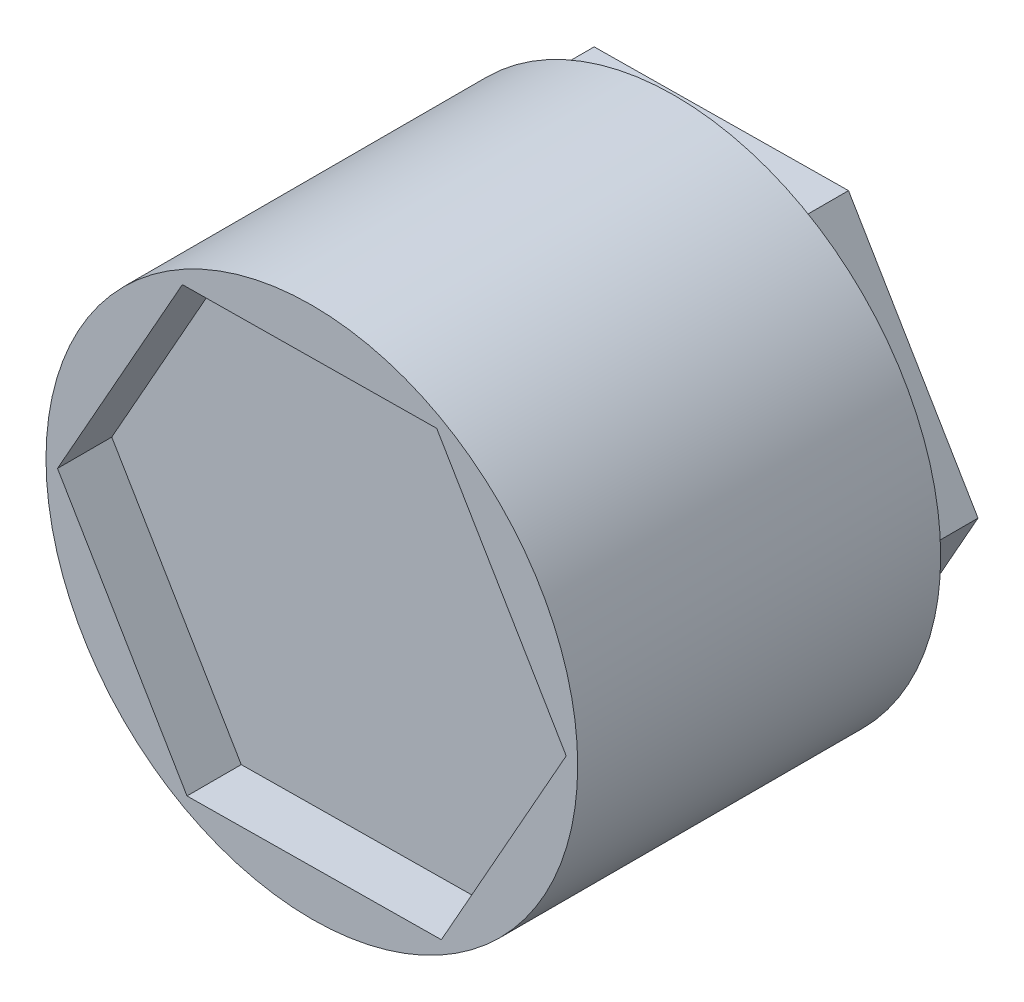
ISO-10303-21;
HEADER;
FILE_DESCRIPTION(('STEP AP214'),'2;1');
FILE_NAME('part.step','',(''),(''),'','','');
FILE_SCHEMA(('AUTOMOTIVE_DESIGN { 1 0 10303 214 1 1 1 1 }'));
ENDSEC;
DATA;
#1=APPLICATION_CONTEXT('core data for automotive mechanical design processes');
#2=APPLICATION_PROTOCOL_DEFINITION('international standard','automotive_design',2000,#1);
#3=PRODUCT_CONTEXT('',#1,'mechanical');
#4=PRODUCT('Part','Part','',(#3));
#5=PRODUCT_RELATED_PRODUCT_CATEGORY('part','',(#4));
#6=PRODUCT_DEFINITION_FORMATION('','',#4);
#7=PRODUCT_DEFINITION_CONTEXT('part definition',#1,'design');
#8=PRODUCT_DEFINITION('design','',#6,#7);
#9=PRODUCT_DEFINITION_SHAPE('','',#8);
#10=(LENGTH_UNIT() NAMED_UNIT(*) SI_UNIT(.MILLI.,.METRE.));
#11=(NAMED_UNIT(*) PLANE_ANGLE_UNIT() SI_UNIT($,.RADIAN.));
#12=(NAMED_UNIT(*) SI_UNIT($,.STERADIAN.) SOLID_ANGLE_UNIT());
#13=UNCERTAINTY_MEASURE_WITH_UNIT(LENGTH_MEASURE(1.E-05),#10,'distance_accuracy_value','');
#14=(GEOMETRIC_REPRESENTATION_CONTEXT(3) GLOBAL_UNCERTAINTY_ASSIGNED_CONTEXT((#13)) GLOBAL_UNIT_ASSIGNED_CONTEXT((#10,
#11,#12)) REPRESENTATION_CONTEXT('',''));
#15=CARTESIAN_POINT('',(0.,0.,0.));
#16=DIRECTION('',(0.,0.,1.));
#17=DIRECTION('',(1.,0.,0.));
#18=AXIS2_PLACEMENT_3D('',#15,#16,#17);
#19=CARTESIAN_POINT('',(11.5060062346083,20.4221730935395,4.5));
#20=DIRECTION('',(0.0105199839304371,-0.999944663437984,0.));
#21=DIRECTION('',(0.999944663437984,0.0105199839304371,0.));
#22=AXIS2_PLACEMENT_3D('',#19,#20,#21);
#23=PLANE('',#22);
#24=DIRECTION('',(-0.999944663437984,-0.0105199839304371,0.));
#25=VECTOR('',#24,1.);
#26=CARTESIAN_POINT('',(11.5060062346083,20.4221730935395,0.));
#27=LINE('',#26,#25);
#28=CARTESIAN_POINT('',(11.5060062346083,20.4221730935395,0.));
#29=VERTEX_POINT('',#28);
#30=CARTESIAN_POINT('',(-11.9331175821841,20.1755802420427,0.));
#31=VERTEX_POINT('',#30);
#32=EDGE_CURVE('E139',#29,#31,#27,.T.);
#33=ORIENTED_EDGE('',*,*,#32,.T.);
#34=DIRECTION('',(0.,0.,-1.));
#35=VECTOR('',#34,1.);
#36=CARTESIAN_POINT('',(-11.9331175821841,20.1755802420427,4.5));
#37=LINE('',#36,#35);
#38=CARTESIAN_POINT('',(-11.9331175821841,20.1755802420427,4.5));
#39=VERTEX_POINT('',#38);
#40=EDGE_CURVE('E11',#39,#31,#37,.T.);
#41=ORIENTED_EDGE('',*,*,#40,.F.);
#42=DIRECTION('',(-0.999944663437984,-0.0105199839304371,0.));
#43=VECTOR('',#42,1.);
#44=CARTESIAN_POINT('',(11.5060062346083,20.4221730935395,4.5));
#45=LINE('',#44,#43);
#46=CARTESIAN_POINT('',(11.5060062346083,20.4221730935395,4.5));
#47=VERTEX_POINT('',#46);
#48=EDGE_CURVE('E128',#47,#39,#45,.T.);
#49=ORIENTED_EDGE('',*,*,#48,.F.);
#50=DIRECTION('',(0.,0.,-1.));
#51=VECTOR('',#50,1.);
#52=CARTESIAN_POINT('',(11.5060062346083,20.4221730935395,4.5));
#53=LINE('',#52,#51);
#54=EDGE_CURVE('E140',#47,#29,#53,.T.);
#55=ORIENTED_EDGE('',*,*,#54,.T.);
#56=EDGE_LOOP('',(#33,#41,#49,#55));
#57=FACE_BOUND('',#56,.T.);
#58=ADVANCED_FACE('F39',(#57),#23,.F.);
#59=CARTESIAN_POINT('',(-11.9331175821841,20.1755802420427,4.5));
#60=DIRECTION('',(0.871237472881193,-0.490861758387829,0.));
#61=DIRECTION('',(0.490861758387829,0.871237472881194,0.));
#62=AXIS2_PLACEMENT_3D('',#59,#60,#61);
#63=PLANE('',#62);
#64=DIRECTION('',(-0.490861758387829,-0.871237472881193,0.));
#65=VECTOR('',#64,1.);
#66=CARTESIAN_POINT('',(-11.9331175821841,20.1755802420427,0.));
#67=LINE('',#66,#65);
#68=CARTESIAN_POINT('',(-23.4391238167924,-0.246592851496795,0.));
#69=VERTEX_POINT('',#68);
#70=EDGE_CURVE('E143',#31,#69,#67,.T.);
#71=ORIENTED_EDGE('',*,*,#70,.T.);
#72=DIRECTION('',(0.,0.,-1.));
#73=VECTOR('',#72,1.);
#74=CARTESIAN_POINT('',(-23.4391238167924,-0.246592851496795,4.5));
#75=LINE('',#74,#73);
#76=CARTESIAN_POINT('',(-23.4391238167924,-0.246592851496795,4.5));
#77=VERTEX_POINT('',#76);
#78=EDGE_CURVE('E46',#77,#69,#75,.T.);
#79=ORIENTED_EDGE('',*,*,#78,.F.);
#80=DIRECTION('',(-0.490861758387829,-0.871237472881193,0.));
#81=VECTOR('',#80,1.);
#82=CARTESIAN_POINT('',(-11.9331175821841,20.1755802420427,4.5));
#83=LINE('',#82,#81);
#84=EDGE_CURVE('E100',#39,#77,#83,.T.);
#85=ORIENTED_EDGE('',*,*,#84,.F.);
#86=ORIENTED_EDGE('',*,*,#40,.T.);
#87=EDGE_LOOP('',(#71,#79,#85,#86));
#88=FACE_BOUND('',#87,.T.);
#89=ADVANCED_FACE('F280',(#88),#63,.F.);
#90=CARTESIAN_POINT('',(-23.4391238167924,-0.246592851496795,4.5));
#91=DIRECTION('',(0.860717488950756,0.509082905050155,0.));
#92=DIRECTION('',(-0.509082905050155,0.860717488950756,0.));
#93=AXIS2_PLACEMENT_3D('',#90,#91,#92);
#94=PLANE('',#93);
#95=DIRECTION('',(0.509082905050155,-0.860717488950756,0.));
#96=VECTOR('',#95,1.);
#97=CARTESIAN_POINT('',(-23.4391238167924,-0.246592851496795,0.));
#98=LINE('',#97,#96);
#99=CARTESIAN_POINT('',(-11.5060062346083,-20.4221730935395,0.));
#100=VERTEX_POINT('',#99);
#101=EDGE_CURVE('E114',#69,#100,#98,.T.);
#102=ORIENTED_EDGE('',*,*,#101,.T.);
#103=DIRECTION('',(0.,0.,-1.));
#104=VECTOR('',#103,1.);
#105=CARTESIAN_POINT('',(-11.5060062346083,-20.4221730935395,4.5));
#106=LINE('',#105,#104);
#107=CARTESIAN_POINT('',(-11.5060062346083,-20.4221730935395,4.5));
#108=VERTEX_POINT('',#107);
#109=EDGE_CURVE('E106',#108,#100,#106,.T.);
#110=ORIENTED_EDGE('',*,*,#109,.F.);
#111=DIRECTION('',(0.509082905050155,-0.860717488950756,0.));
#112=VECTOR('',#111,1.);
#113=CARTESIAN_POINT('',(-23.4391238167924,-0.246592851496795,4.5));
#114=LINE('',#113,#112);
#115=EDGE_CURVE('E112',#77,#108,#114,.T.);
#116=ORIENTED_EDGE('',*,*,#115,.F.);
#117=ORIENTED_EDGE('',*,*,#78,.T.);
#118=EDGE_LOOP('',(#102,#110,#116,#117));
#119=FACE_BOUND('',#118,.T.);
#120=ADVANCED_FACE('F107',(#119),#94,.F.);
#121=CARTESIAN_POINT('',(-11.5060062346083,-20.4221730935395,4.5));
#122=DIRECTION('',(-0.0105199839304372,0.999944663437984,0.));
#123=DIRECTION('',(-0.999944663437984,-0.0105199839304372,0.));
#124=AXIS2_PLACEMENT_3D('',#121,#122,#123);
#125=PLANE('',#124);
#126=DIRECTION('',(0.999944663437984,0.0105199839304372,0.));
#127=VECTOR('',#126,1.);
#128=CARTESIAN_POINT('',(-11.5060062346083,-20.4221730935395,0.));
#129=LINE('',#128,#127);
#130=CARTESIAN_POINT('',(11.9331175821841,-20.1755802420427,0.));
#131=VERTEX_POINT('',#130);
#132=EDGE_CURVE('E144',#100,#131,#129,.T.);
#133=ORIENTED_EDGE('',*,*,#132,.T.);
#134=DIRECTION('',(0.,0.,-1.));
#135=VECTOR('',#134,1.);
#136=CARTESIAN_POINT('',(11.9331175821841,-20.1755802420427,4.5));
#137=LINE('',#136,#135);
#138=CARTESIAN_POINT('',(11.9331175821841,-20.1755802420427,4.5));
#139=VERTEX_POINT('',#138);
#140=EDGE_CURVE('E117',#139,#131,#137,.T.);
#141=ORIENTED_EDGE('',*,*,#140,.F.);
#142=DIRECTION('',(0.999944663437984,0.0105199839304372,0.));
#143=VECTOR('',#142,1.);
#144=CARTESIAN_POINT('',(-11.5060062346083,-20.4221730935395,4.5));
#145=LINE('',#144,#143);
#146=EDGE_CURVE('E116',#108,#139,#145,.T.);
#147=ORIENTED_EDGE('',*,*,#146,.F.);
#148=ORIENTED_EDGE('',*,*,#109,.T.);
#149=EDGE_LOOP('',(#133,#141,#147,#148));
#150=FACE_BOUND('',#149,.T.);
#151=ADVANCED_FACE('F118',(#150),#125,.F.);
#152=CARTESIAN_POINT('',(11.9331175821841,-20.1755802420427,4.5));
#153=DIRECTION('',(-0.871237472881193,0.490861758387829,0.));
#154=DIRECTION('',(-0.490861758387829,-0.871237472881194,0.));
#155=AXIS2_PLACEMENT_3D('',#152,#153,#154);
#156=PLANE('',#155);
#157=DIRECTION('',(0.490861758387829,0.871237472881193,0.));
#158=VECTOR('',#157,1.);
#159=CARTESIAN_POINT('',(11.9331175821841,-20.1755802420427,0.));
#160=LINE('',#159,#158);
#161=CARTESIAN_POINT('',(23.4391238167924,0.246592851496804,0.));
#162=VERTEX_POINT('',#161);
#163=EDGE_CURVE('E150',#131,#162,#160,.T.);
#164=ORIENTED_EDGE('',*,*,#163,.T.);
#165=DIRECTION('',(0.,0.,-1.));
#166=VECTOR('',#165,1.);
#167=CARTESIAN_POINT('',(23.4391238167924,0.246592851496804,4.5));
#168=LINE('',#167,#166);
#169=CARTESIAN_POINT('',(23.4391238167924,0.246592851496804,4.5));
#170=VERTEX_POINT('',#169);
#171=EDGE_CURVE('E65',#170,#162,#168,.T.);
#172=ORIENTED_EDGE('',*,*,#171,.F.);
#173=DIRECTION('',(0.490861758387829,0.871237472881193,0.));
#174=VECTOR('',#173,1.);
#175=CARTESIAN_POINT('',(11.9331175821841,-20.1755802420427,4.5));
#176=LINE('',#175,#174);
#177=EDGE_CURVE('E121',#139,#170,#176,.T.);
#178=ORIENTED_EDGE('',*,*,#177,.F.);
#179=ORIENTED_EDGE('',*,*,#140,.T.);
#180=EDGE_LOOP('',(#164,#172,#178,#179));
#181=FACE_BOUND('',#180,.T.);
#182=ADVANCED_FACE('F156',(#181),#156,.F.);
#183=CARTESIAN_POINT('',(23.4391238167924,0.246592851496804,4.5));
#184=DIRECTION('',(-0.860717488950756,-0.509082905050155,0.));
#185=DIRECTION('',(0.509082905050155,-0.860717488950756,0.));
#186=AXIS2_PLACEMENT_3D('',#183,#184,#185);
#187=PLANE('',#186);
#188=DIRECTION('',(-0.509082905050155,0.860717488950756,0.));
#189=VECTOR('',#188,1.);
#190=CARTESIAN_POINT('',(23.4391238167924,0.246592851496804,0.));
#191=LINE('',#190,#189);
#192=EDGE_CURVE('E90',#162,#29,#191,.T.);
#193=ORIENTED_EDGE('',*,*,#192,.T.);
#194=ORIENTED_EDGE('',*,*,#54,.F.);
#195=DIRECTION('',(-0.509082905050155,0.860717488950756,0.));
#196=VECTOR('',#195,1.);
#197=CARTESIAN_POINT('',(23.4391238167924,0.246592851496804,4.5));
#198=LINE('',#197,#196);
#199=EDGE_CURVE('E133',#170,#47,#198,.T.);
#200=ORIENTED_EDGE('',*,*,#199,.F.);
#201=ORIENTED_EDGE('',*,*,#171,.T.);
#202=EDGE_LOOP('',(#193,#194,#200,#201));
#203=FACE_BOUND('',#202,.T.);
#204=ADVANCED_FACE('F157',(#203),#187,.F.);
#205=CARTESIAN_POINT('',(0.,0.,0.));
#206=DIRECTION('',(0.,0.,1.));
#207=DIRECTION('',(1.,0.,0.));
#208=AXIS2_PLACEMENT_3D('',#205,#206,#207);
#209=PLANE('',#208);
#210=ORIENTED_EDGE('',*,*,#32,.F.);
#211=ORIENTED_EDGE('',*,*,#192,.F.);
#212=ORIENTED_EDGE('',*,*,#163,.F.);
#213=ORIENTED_EDGE('',*,*,#132,.F.);
#214=ORIENTED_EDGE('',*,*,#101,.F.);
#215=ORIENTED_EDGE('',*,*,#70,.F.);
#216=EDGE_LOOP('',(#210,#211,#212,#213,#214,#215));
#217=FACE_BOUND('',#216,.T.);
#218=ADVANCED_FACE('F152',(#217),#209,.F.);
#219=CARTESIAN_POINT('',(0.,0.,4.5));
#220=DIRECTION('',(0.,0.,1.));
#221=DIRECTION('',(1.,0.,0.));
#222=AXIS2_PLACEMENT_3D('',#219,#220,#221);
#223=PLANE('',#222);
#224=CARTESIAN_POINT('',(0.,0.,4.5));
#225=DIRECTION('',(0.,0.,1.));
#226=DIRECTION('',(1.,0.,0.));
#227=AXIS2_PLACEMENT_3D('',#224,#225,#226);
#228=CIRCLE('',#227,24.5);
#229=CARTESIAN_POINT('',(24.5,0.,4.5));
#230=VERTEX_POINT('',#229);
#231=EDGE_CURVE('E165',#230,#230,#228,.T.);
#232=ORIENTED_EDGE('',*,*,#231,.F.);
#233=EDGE_LOOP('',(#232));
#234=FACE_BOUND('',#233,.T.);
#235=ORIENTED_EDGE('',*,*,#199,.T.);
#236=ORIENTED_EDGE('',*,*,#48,.T.);
#237=ORIENTED_EDGE('',*,*,#84,.T.);
#238=ORIENTED_EDGE('',*,*,#115,.T.);
#239=ORIENTED_EDGE('',*,*,#146,.T.);
#240=ORIENTED_EDGE('',*,*,#177,.T.);
#241=EDGE_LOOP('',(#235,#236,#237,#238,#239,#240));
#242=FACE_BOUND('',#241,.T.);
#243=ADVANCED_FACE('F130',(#234,#242),#223,.F.);
#244=CARTESIAN_POINT('',(0.,0.,37.95));
#245=DIRECTION('',(0.,0.,-1.));
#246=DIRECTION('',(-1.,0.,0.));
#247=AXIS2_PLACEMENT_3D('',#244,#245,#246);
#248=CYLINDRICAL_SURFACE('',#247,24.5);
#249=CARTESIAN_POINT('',(0.,0.,37.95));
#250=DIRECTION('',(0.,0.,1.));
#251=DIRECTION('',(1.,0.,0.));
#252=AXIS2_PLACEMENT_3D('',#249,#250,#251);
#253=CIRCLE('',#252,24.5);
#254=CARTESIAN_POINT('',(24.5,0.,37.95));
#255=VERTEX_POINT('',#254);
#256=EDGE_CURVE('E142',#255,#255,#253,.T.);
#257=ORIENTED_EDGE('',*,*,#256,.F.);
#258=EDGE_LOOP('',(#257));
#259=FACE_BOUND('',#258,.T.);
#260=ORIENTED_EDGE('',*,*,#231,.T.);
#261=EDGE_LOOP('',(#260));
#262=FACE_BOUND('',#261,.T.);
#263=ADVANCED_FACE('F294',(#259,#262),#248,.T.);
#264=CARTESIAN_POINT('',(0.,0.,37.95));
#265=DIRECTION('',(0.,0.,1.));
#266=DIRECTION('',(1.,0.,0.));
#267=AXIS2_PLACEMENT_3D('',#264,#265,#266);
#268=PLANE('',#267);
#269=DIRECTION('',(-0.509082905050164,0.860717488950751,0.));
#270=VECTOR('',#269,1.);
#271=CARTESIAN_POINT('',(23.4391238167924,0.246592851497044,37.95));
#272=LINE('',#271,#270);
#273=CARTESIAN_POINT('',(23.4391238167924,0.246592851497044,37.95));
#274=VERTEX_POINT('',#273);
#275=CARTESIAN_POINT('',(11.5060062346081,20.4221730935396,37.95));
#276=VERTEX_POINT('',#275);
#277=EDGE_CURVE('E52',#274,#276,#272,.T.);
#278=ORIENTED_EDGE('',*,*,#277,.F.);
#279=DIRECTION('',(0.490861758387821,0.871237472881198,0.));
#280=VECTOR('',#279,1.);
#281=CARTESIAN_POINT('',(11.9331175821843,-20.1755802420426,37.95));
#282=LINE('',#281,#280);
#283=CARTESIAN_POINT('',(11.9331175821843,-20.1755802420426,37.95));
#284=VERTEX_POINT('',#283);
#285=EDGE_CURVE('E184',#284,#274,#282,.T.);
#286=ORIENTED_EDGE('',*,*,#285,.F.);
#287=DIRECTION('',(0.999944663437984,0.0105199839304472,0.));
#288=VECTOR('',#287,1.);
#289=CARTESIAN_POINT('',(-11.5060062346081,-20.4221730935396,37.95));
#290=LINE('',#289,#288);
#291=CARTESIAN_POINT('',(-11.5060062346081,-20.4221730935396,37.95));
#292=VERTEX_POINT('',#291);
#293=EDGE_CURVE('E189',#292,#284,#290,.T.);
#294=ORIENTED_EDGE('',*,*,#293,.F.);
#295=DIRECTION('',(0.509082905050164,-0.860717488950751,0.));
#296=VECTOR('',#295,1.);
#297=CARTESIAN_POINT('',(-23.4391238167924,-0.246592851497044,37.95));
#298=LINE('',#297,#296);
#299=CARTESIAN_POINT('',(-23.4391238167924,-0.246592851497044,37.95));
#300=VERTEX_POINT('',#299);
#301=EDGE_CURVE('E192',#300,#292,#298,.T.);
#302=ORIENTED_EDGE('',*,*,#301,.F.);
#303=DIRECTION('',(-0.49086175838782,-0.871237472881198,0.));
#304=VECTOR('',#303,1.);
#305=CARTESIAN_POINT('',(-11.9331175821843,20.1755802420425,37.95));
#306=LINE('',#305,#304);
#307=CARTESIAN_POINT('',(-11.9331175821843,20.1755802420425,37.95));
#308=VERTEX_POINT('',#307);
#309=EDGE_CURVE('E191',#308,#300,#306,.T.);
#310=ORIENTED_EDGE('',*,*,#309,.F.);
#311=DIRECTION('',(-0.999944663437984,-0.0105199839304473,0.));
#312=VECTOR('',#311,1.);
#313=CARTESIAN_POINT('',(11.5060062346081,20.4221730935396,37.95));
#314=LINE('',#313,#312);
#315=EDGE_CURVE('E197',#276,#308,#314,.T.);
#316=ORIENTED_EDGE('',*,*,#315,.F.);
#317=EDGE_LOOP('',(#278,#286,#294,#302,#310,#316));
#318=FACE_BOUND('',#317,.T.);
#319=ORIENTED_EDGE('',*,*,#256,.T.);
#320=EDGE_LOOP('',(#319));
#321=FACE_BOUND('',#320,.T.);
#322=ADVANCED_FACE('F253',(#318,#321),#268,.T.);
#323=CARTESIAN_POINT('',(23.4391238167924,0.246592851497044,32.95));
#324=DIRECTION('',(0.860717488950751,0.509082905050164,0.));
#325=DIRECTION('',(-0.509082905050164,0.860717488950751,0.));
#326=AXIS2_PLACEMENT_3D('',#323,#324,#325);
#327=PLANE('',#326);
#328=ORIENTED_EDGE('',*,*,#277,.T.);
#329=DIRECTION('',(0.,0.,1.));
#330=VECTOR('',#329,1.);
#331=CARTESIAN_POINT('',(11.5060062346081,20.4221730935396,32.95));
#332=LINE('',#331,#330);
#333=CARTESIAN_POINT('',(11.5060062346081,20.4221730935396,32.95));
#334=VERTEX_POINT('',#333);
#335=EDGE_CURVE('E169',#334,#276,#332,.T.);
#336=ORIENTED_EDGE('',*,*,#335,.F.);
#337=DIRECTION('',(-0.509082905050164,0.860717488950751,0.));
#338=VECTOR('',#337,1.);
#339=CARTESIAN_POINT('',(23.4391238167924,0.246592851497044,32.95));
#340=LINE('',#339,#338);
#341=CARTESIAN_POINT('',(23.4391238167924,0.246592851497044,32.95));
#342=VERTEX_POINT('',#341);
#343=EDGE_CURVE('E190',#342,#334,#340,.T.);
#344=ORIENTED_EDGE('',*,*,#343,.F.);
#345=DIRECTION('',(0.,0.,1.));
#346=VECTOR('',#345,1.);
#347=CARTESIAN_POINT('',(23.4391238167924,0.246592851497044,32.95));
#348=LINE('',#347,#346);
#349=EDGE_CURVE('E164',#342,#274,#348,.T.);
#350=ORIENTED_EDGE('',*,*,#349,.T.);
#351=EDGE_LOOP('',(#328,#336,#344,#350));
#352=FACE_BOUND('',#351,.T.);
#353=ADVANCED_FACE('F223',(#352),#327,.F.);
#354=CARTESIAN_POINT('',(11.9331175821843,-20.1755802420426,32.95));
#355=DIRECTION('',(0.871237472881198,-0.490861758387821,0.));
#356=DIRECTION('',(0.490861758387821,0.871237472881198,0.));
#357=AXIS2_PLACEMENT_3D('',#354,#355,#356);
#358=PLANE('',#357);
#359=ORIENTED_EDGE('',*,*,#285,.T.);
#360=ORIENTED_EDGE('',*,*,#349,.F.);
#361=DIRECTION('',(0.490861758387821,0.871237472881198,0.));
#362=VECTOR('',#361,1.);
#363=CARTESIAN_POINT('',(11.9331175821843,-20.1755802420426,32.95));
#364=LINE('',#363,#362);
#365=CARTESIAN_POINT('',(11.9331175821843,-20.1755802420426,32.95));
#366=VERTEX_POINT('',#365);
#367=EDGE_CURVE('E172',#366,#342,#364,.T.);
#368=ORIENTED_EDGE('',*,*,#367,.F.);
#369=DIRECTION('',(0.,0.,1.));
#370=VECTOR('',#369,1.);
#371=CARTESIAN_POINT('',(11.9331175821843,-20.1755802420426,32.95));
#372=LINE('',#371,#370);
#373=EDGE_CURVE('E178',#366,#284,#372,.T.);
#374=ORIENTED_EDGE('',*,*,#373,.T.);
#375=EDGE_LOOP('',(#359,#360,#368,#374));
#376=FACE_BOUND('',#375,.T.);
#377=ADVANCED_FACE('F245',(#376),#358,.F.);
#378=CARTESIAN_POINT('',(-11.5060062346081,-20.4221730935396,32.95));
#379=DIRECTION('',(0.0105199839304472,-0.999944663437984,0.));
#380=DIRECTION('',(0.999944663437984,0.0105199839304472,0.));
#381=AXIS2_PLACEMENT_3D('',#378,#379,#380);
#382=PLANE('',#381);
#383=ORIENTED_EDGE('',*,*,#293,.T.);
#384=ORIENTED_EDGE('',*,*,#373,.F.);
#385=DIRECTION('',(0.999944663437984,0.0105199839304472,0.));
#386=VECTOR('',#385,1.);
#387=CARTESIAN_POINT('',(-11.5060062346081,-20.4221730935396,32.95));
#388=LINE('',#387,#386);
#389=CARTESIAN_POINT('',(-11.5060062346081,-20.4221730935396,32.95));
#390=VERTEX_POINT('',#389);
#391=EDGE_CURVE('E201',#390,#366,#388,.T.);
#392=ORIENTED_EDGE('',*,*,#391,.F.);
#393=DIRECTION('',(0.,0.,1.));
#394=VECTOR('',#393,1.);
#395=CARTESIAN_POINT('',(-11.5060062346081,-20.4221730935396,32.95));
#396=LINE('',#395,#394);
#397=EDGE_CURVE('E180',#390,#292,#396,.T.);
#398=ORIENTED_EDGE('',*,*,#397,.T.);
#399=EDGE_LOOP('',(#383,#384,#392,#398));
#400=FACE_BOUND('',#399,.T.);
#401=ADVANCED_FACE('F250',(#400),#382,.F.);
#402=CARTESIAN_POINT('',(-23.4391238167924,-0.246592851497044,32.95));
#403=DIRECTION('',(-0.860717488950751,-0.509082905050164,0.));
#404=DIRECTION('',(0.509082905050164,-0.860717488950751,0.));
#405=AXIS2_PLACEMENT_3D('',#402,#403,#404);
#406=PLANE('',#405);
#407=ORIENTED_EDGE('',*,*,#301,.T.);
#408=ORIENTED_EDGE('',*,*,#397,.F.);
#409=DIRECTION('',(0.509082905050164,-0.860717488950751,0.));
#410=VECTOR('',#409,1.);
#411=CARTESIAN_POINT('',(-23.4391238167924,-0.246592851497044,32.95));
#412=LINE('',#411,#410);
#413=CARTESIAN_POINT('',(-23.4391238167924,-0.246592851497044,32.95));
#414=VERTEX_POINT('',#413);
#415=EDGE_CURVE('E206',#414,#390,#412,.T.);
#416=ORIENTED_EDGE('',*,*,#415,.F.);
#417=DIRECTION('',(0.,0.,1.));
#418=VECTOR('',#417,1.);
#419=CARTESIAN_POINT('',(-23.4391238167924,-0.246592851497044,32.95));
#420=LINE('',#419,#418);
#421=EDGE_CURVE('E171',#414,#300,#420,.T.);
#422=ORIENTED_EDGE('',*,*,#421,.T.);
#423=EDGE_LOOP('',(#407,#408,#416,#422));
#424=FACE_BOUND('',#423,.T.);
#425=ADVANCED_FACE('F270',(#424),#406,.F.);
#426=CARTESIAN_POINT('',(-11.9331175821843,20.1755802420425,32.95));
#427=DIRECTION('',(-0.871237472881198,0.49086175838782,0.));
#428=DIRECTION('',(-0.49086175838782,-0.871237472881199,0.));
#429=AXIS2_PLACEMENT_3D('',#426,#427,#428);
#430=PLANE('',#429);
#431=ORIENTED_EDGE('',*,*,#309,.T.);
#432=ORIENTED_EDGE('',*,*,#421,.F.);
#433=DIRECTION('',(-0.49086175838782,-0.871237472881198,0.));
#434=VECTOR('',#433,1.);
#435=CARTESIAN_POINT('',(-11.9331175821843,20.1755802420425,32.95));
#436=LINE('',#435,#434);
#437=CARTESIAN_POINT('',(-11.9331175821843,20.1755802420425,32.95));
#438=VERTEX_POINT('',#437);
#439=EDGE_CURVE('E207',#438,#414,#436,.T.);
#440=ORIENTED_EDGE('',*,*,#439,.F.);
#441=DIRECTION('',(0.,0.,1.));
#442=VECTOR('',#441,1.);
#443=CARTESIAN_POINT('',(-11.9331175821843,20.1755802420425,32.95));
#444=LINE('',#443,#442);
#445=EDGE_CURVE('E168',#438,#308,#444,.T.);
#446=ORIENTED_EDGE('',*,*,#445,.T.);
#447=EDGE_LOOP('',(#431,#432,#440,#446));
#448=FACE_BOUND('',#447,.T.);
#449=ADVANCED_FACE('F263',(#448),#430,.F.);
#450=CARTESIAN_POINT('',(11.5060062346081,20.4221730935396,32.95));
#451=DIRECTION('',(-0.0105199839304473,0.999944663437984,0.));
#452=DIRECTION('',(-0.999944663437984,-0.0105199839304473,0.));
#453=AXIS2_PLACEMENT_3D('',#450,#451,#452);
#454=PLANE('',#453);
#455=ORIENTED_EDGE('',*,*,#315,.T.);
#456=ORIENTED_EDGE('',*,*,#445,.F.);
#457=DIRECTION('',(-0.999944663437984,-0.0105199839304473,0.));
#458=VECTOR('',#457,1.);
#459=CARTESIAN_POINT('',(11.5060062346081,20.4221730935396,32.95));
#460=LINE('',#459,#458);
#461=EDGE_CURVE('E215',#334,#438,#460,.T.);
#462=ORIENTED_EDGE('',*,*,#461,.F.);
#463=ORIENTED_EDGE('',*,*,#335,.T.);
#464=EDGE_LOOP('',(#455,#456,#462,#463));
#465=FACE_BOUND('',#464,.T.);
#466=ADVANCED_FACE('F260',(#465),#454,.F.);
#467=CARTESIAN_POINT('',(0.,0.,32.95));
#468=DIRECTION('',(0.,0.,1.));
#469=DIRECTION('',(1.,0.,0.));
#470=AXIS2_PLACEMENT_3D('',#467,#468,#469);
#471=PLANE('',#470);
#472=ORIENTED_EDGE('',*,*,#343,.T.);
#473=ORIENTED_EDGE('',*,*,#461,.T.);
#474=ORIENTED_EDGE('',*,*,#439,.T.);
#475=ORIENTED_EDGE('',*,*,#415,.T.);
#476=ORIENTED_EDGE('',*,*,#391,.T.);
#477=ORIENTED_EDGE('',*,*,#367,.T.);
#478=EDGE_LOOP('',(#472,#473,#474,#475,#476,#477));
#479=FACE_BOUND('',#478,.T.);
#480=ADVANCED_FACE('F218',(#479),#471,.T.);
#481=CLOSED_SHELL('',(#58,#89,#120,#151,#182,#204,#218,#243,#263,#322,#353,#377,#401,#425,#449,
#466,#480));
#482=MANIFOLD_SOLID_BREP('B2',#481);
#483=ADVANCED_BREP_SHAPE_REPRESENTATION('',(#18,#482),#14);
#484=SHAPE_DEFINITION_REPRESENTATION(#9,#483);
ENDSEC;
END-ISO-10303-21;
